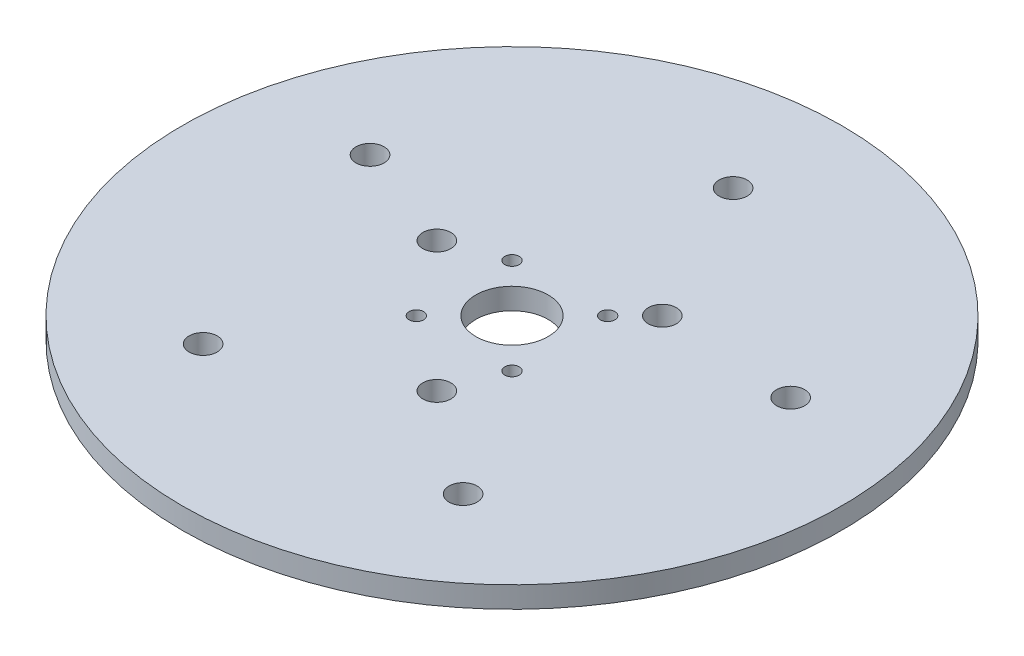
ISO-10303-21;
HEADER;
FILE_DESCRIPTION(('STEP AP214'),'2;1');
FILE_NAME('part.step','',(''),(''),'','','');
FILE_SCHEMA(('AUTOMOTIVE_DESIGN { 1 0 10303 214 1 1 1 1 }'));
ENDSEC;
DATA;
#1=APPLICATION_CONTEXT('core data for automotive mechanical design processes');
#2=APPLICATION_PROTOCOL_DEFINITION('international standard','automotive_design',2000,#1);
#3=PRODUCT_CONTEXT('',#1,'mechanical');
#4=PRODUCT('Part','Part','',(#3));
#5=PRODUCT_RELATED_PRODUCT_CATEGORY('part','',(#4));
#6=PRODUCT_DEFINITION_FORMATION('','',#4);
#7=PRODUCT_DEFINITION_CONTEXT('part definition',#1,'design');
#8=PRODUCT_DEFINITION('design','',#6,#7);
#9=PRODUCT_DEFINITION_SHAPE('','',#8);
#10=(LENGTH_UNIT() NAMED_UNIT(*) SI_UNIT(.MILLI.,.METRE.));
#11=(NAMED_UNIT(*) PLANE_ANGLE_UNIT() SI_UNIT($,.RADIAN.));
#12=(NAMED_UNIT(*) SI_UNIT($,.STERADIAN.) SOLID_ANGLE_UNIT());
#13=UNCERTAINTY_MEASURE_WITH_UNIT(LENGTH_MEASURE(1.E-05),#10,'distance_accuracy_value','');
#14=(GEOMETRIC_REPRESENTATION_CONTEXT(3) GLOBAL_UNCERTAINTY_ASSIGNED_CONTEXT((#13)) GLOBAL_UNIT_ASSIGNED_CONTEXT((#10,
#11,#12)) REPRESENTATION_CONTEXT('',''));
#15=CARTESIAN_POINT('',(0.,0.,0.));
#16=DIRECTION('',(0.,0.,1.));
#17=DIRECTION('',(1.,0.,0.));
#18=AXIS2_PLACEMENT_3D('',#15,#16,#17);
#19=CARTESIAN_POINT('',(0.,5.,0.));
#20=DIRECTION('',(0.,1.,0.));
#21=DIRECTION('',(0.,0.,1.));
#22=AXIS2_PLACEMENT_3D('',#19,#20,#21);
#23=PLANE('',#22);
#24=CARTESIAN_POINT('',(17.6776695296637,5.,-17.6776695296637));
#25=DIRECTION('',(0.,1.,0.));
#26=DIRECTION('',(0.,0.,1.));
#27=AXIS2_PLACEMENT_3D('',#24,#25,#26);
#28=CIRCLE('',#27,3.3);
#29=CARTESIAN_POINT('',(17.6776695296637,5.,-14.3776695296637));
#30=VERTEX_POINT('',#29);
#31=EDGE_CURVE('E118',#30,#30,#28,.T.);
#32=ORIENTED_EDGE('',*,*,#31,.F.);
#33=EDGE_LOOP('',(#32));
#34=FACE_BOUND('',#33,.T.);
#35=CARTESIAN_POINT('',(6.47047612756299,5.,24.1481456572267));
#36=DIRECTION('',(0.,1.,0.));
#37=DIRECTION('',(0.,0.,1.));
#38=AXIS2_PLACEMENT_3D('',#35,#36,#37);
#39=CIRCLE('',#38,3.3);
#40=CARTESIAN_POINT('',(6.47047612756299,5.,27.4481456572267));
#41=VERTEX_POINT('',#40);
#42=EDGE_CURVE('E112',#41,#41,#39,.T.);
#43=ORIENTED_EDGE('',*,*,#42,.F.);
#44=EDGE_LOOP('',(#43));
#45=FACE_BOUND('',#44,.T.);
#46=CARTESIAN_POINT('',(-24.1481456572267,5.,-6.47047612756307));
#47=DIRECTION('',(0.,1.,0.));
#48=DIRECTION('',(0.,0.,1.));
#49=AXIS2_PLACEMENT_3D('',#46,#47,#48);
#50=CIRCLE('',#49,3.3);
#51=CARTESIAN_POINT('',(-24.1481456572267,5.,-3.17047612756307));
#52=VERTEX_POINT('',#51);
#53=EDGE_CURVE('E106',#52,#52,#50,.T.);
#54=ORIENTED_EDGE('',*,*,#53,.F.);
#55=EDGE_LOOP('',(#54));
#56=FACE_BOUND('',#55,.T.);
#57=CARTESIAN_POINT('',(-11.25,5.,-11.25));
#58=DIRECTION('',(0.,1.,0.));
#59=DIRECTION('',(0.,0.,1.));
#60=AXIS2_PLACEMENT_3D('',#57,#58,#59);
#61=CIRCLE('',#60,1.7);
#62=CARTESIAN_POINT('',(-11.25,5.,-9.55));
#63=VERTEX_POINT('',#62);
#64=EDGE_CURVE('E100',#63,#63,#61,.T.);
#65=ORIENTED_EDGE('',*,*,#64,.F.);
#66=EDGE_LOOP('',(#65));
#67=FACE_BOUND('',#66,.T.);
#68=CARTESIAN_POINT('',(11.25,5.,11.25));
#69=DIRECTION('',(0.,1.,0.));
#70=DIRECTION('',(0.,0.,1.));
#71=AXIS2_PLACEMENT_3D('',#68,#69,#70);
#72=CIRCLE('',#71,1.7);
#73=CARTESIAN_POINT('',(11.25,5.,12.95));
#74=VERTEX_POINT('',#73);
#75=EDGE_CURVE('E94',#74,#74,#72,.T.);
#76=ORIENTED_EDGE('',*,*,#75,.F.);
#77=EDGE_LOOP('',(#76));
#78=FACE_BOUND('',#77,.T.);
#79=CARTESIAN_POINT('',(11.25,5.,-11.25));
#80=DIRECTION('',(0.,1.,0.));
#81=DIRECTION('',(0.,0.,1.));
#82=AXIS2_PLACEMENT_3D('',#79,#80,#81);
#83=CIRCLE('',#82,1.7);
#84=CARTESIAN_POINT('',(11.25,5.,-9.55));
#85=VERTEX_POINT('',#84);
#86=EDGE_CURVE('E88',#85,#85,#83,.T.);
#87=ORIENTED_EDGE('',*,*,#86,.F.);
#88=EDGE_LOOP('',(#87));
#89=FACE_BOUND('',#88,.T.);
#90=CARTESIAN_POINT('',(-11.25,5.,11.25));
#91=DIRECTION('',(0.,1.,0.));
#92=DIRECTION('',(0.,0.,1.));
#93=AXIS2_PLACEMENT_3D('',#90,#91,#92);
#94=CIRCLE('',#93,1.7);
#95=CARTESIAN_POINT('',(-11.25,5.,12.95));
#96=VERTEX_POINT('',#95);
#97=EDGE_CURVE('E82',#96,#96,#94,.T.);
#98=ORIENTED_EDGE('',*,*,#97,.F.);
#99=EDGE_LOOP('',(#98));
#100=FACE_BOUND('',#99,.T.);
#101=CARTESIAN_POINT('',(0.,5.,-52.));
#102=DIRECTION('',(0.,1.,0.));
#103=DIRECTION('',(0.,0.,1.));
#104=AXIS2_PLACEMENT_3D('',#101,#102,#103);
#105=CIRCLE('',#104,3.29999999999999);
#106=CARTESIAN_POINT('',(0.,5.,-48.7));
#107=VERTEX_POINT('',#106);
#108=EDGE_CURVE('E76',#107,#107,#105,.T.);
#109=ORIENTED_EDGE('',*,*,#108,.F.);
#110=EDGE_LOOP('',(#109));
#111=FACE_BOUND('',#110,.T.);
#112=CARTESIAN_POINT('',(49.454938847348,5.,-16.0688837074973));
#113=DIRECTION('',(0.,1.,0.));
#114=DIRECTION('',(0.,0.,1.));
#115=AXIS2_PLACEMENT_3D('',#112,#113,#114);
#116=CIRCLE('',#115,3.29999999999998);
#117=CARTESIAN_POINT('',(49.454938847348,5.,-12.7688837074973));
#118=VERTEX_POINT('',#117);
#119=EDGE_CURVE('E70',#118,#118,#116,.T.);
#120=ORIENTED_EDGE('',*,*,#119,.F.);
#121=EDGE_LOOP('',(#120));
#122=FACE_BOUND('',#121,.T.);
#123=CARTESIAN_POINT('',(30.5648331192086,5.,42.0688837074973));
#124=DIRECTION('',(0.,1.,0.));
#125=DIRECTION('',(0.,0.,1.));
#126=AXIS2_PLACEMENT_3D('',#123,#124,#125);
#127=CIRCLE('',#126,3.29999999999999);
#128=CARTESIAN_POINT('',(30.5648331192086,5.,45.3688837074972));
#129=VERTEX_POINT('',#128);
#130=EDGE_CURVE('E64',#129,#129,#127,.T.);
#131=ORIENTED_EDGE('',*,*,#130,.F.);
#132=EDGE_LOOP('',(#131));
#133=FACE_BOUND('',#132,.T.);
#134=CARTESIAN_POINT('',(-30.5648331192086,5.,42.0688837074973));
#135=DIRECTION('',(0.,1.,0.));
#136=DIRECTION('',(0.,0.,1.));
#137=AXIS2_PLACEMENT_3D('',#134,#135,#136);
#138=CIRCLE('',#137,3.29999999999999);
#139=CARTESIAN_POINT('',(-30.5648331192086,5.,45.3688837074973));
#140=VERTEX_POINT('',#139);
#141=EDGE_CURVE('E58',#140,#140,#138,.T.);
#142=ORIENTED_EDGE('',*,*,#141,.F.);
#143=EDGE_LOOP('',(#142));
#144=FACE_BOUND('',#143,.T.);
#145=CARTESIAN_POINT('',(-49.454938847348,5.,-16.0688837074973));
#146=DIRECTION('',(0.,1.,0.));
#147=DIRECTION('',(0.,0.,1.));
#148=AXIS2_PLACEMENT_3D('',#145,#146,#147);
#149=CIRCLE('',#148,3.29999999999999);
#150=CARTESIAN_POINT('',(-49.454938847348,5.,-12.7688837074973));
#151=VERTEX_POINT('',#150);
#152=EDGE_CURVE('E52',#151,#151,#149,.T.);
#153=ORIENTED_EDGE('',*,*,#152,.F.);
#154=EDGE_LOOP('',(#153));
#155=FACE_BOUND('',#154,.T.);
#156=CARTESIAN_POINT('',(0.,5.,0.));
#157=DIRECTION('',(0.,1.,0.));
#158=DIRECTION('',(0.,0.,1.));
#159=AXIS2_PLACEMENT_3D('',#156,#157,#158);
#160=CIRCLE('',#159,77.5);
#161=CARTESIAN_POINT('',(0.,5.,77.5));
#162=VERTEX_POINT('',#161);
#163=EDGE_CURVE('E10',#162,#162,#160,.T.);
#164=ORIENTED_EDGE('',*,*,#163,.T.);
#165=EDGE_LOOP('',(#164));
#166=FACE_BOUND('',#165,.T.);
#167=CARTESIAN_POINT('',(0.,5.,0.));
#168=DIRECTION('',(0.,1.,0.));
#169=DIRECTION('',(0.,0.,1.));
#170=AXIS2_PLACEMENT_3D('',#167,#168,#169);
#171=CIRCLE('',#170,8.5);
#172=CARTESIAN_POINT('',(0.,5.,8.5));
#173=VERTEX_POINT('',#172);
#174=EDGE_CURVE('E42',#173,#173,#171,.T.);
#175=ORIENTED_EDGE('',*,*,#174,.F.);
#176=EDGE_LOOP('',(#175));
#177=FACE_BOUND('',#176,.T.);
#178=ADVANCED_FACE('F31',(#34,#45,#56,#67,#78,#89,#100,#111,#122,#133,#144,#155,#166,#177),#23,.T.);
#179=CARTESIAN_POINT('',(0.,0.,0.));
#180=DIRECTION('',(0.,1.,0.));
#181=DIRECTION('',(0.,0.,1.));
#182=AXIS2_PLACEMENT_3D('',#179,#180,#181);
#183=PLANE('',#182);
#184=CARTESIAN_POINT('',(17.6776695296637,0.,-17.6776695296637));
#185=DIRECTION('',(0.,1.,0.));
#186=DIRECTION('',(0.,0.,1.));
#187=AXIS2_PLACEMENT_3D('',#184,#185,#186);
#188=CIRCLE('',#187,3.3);
#189=CARTESIAN_POINT('',(17.6776695296637,0.,-14.3776695296637));
#190=VERTEX_POINT('',#189);
#191=EDGE_CURVE('E115',#190,#190,#188,.T.);
#192=ORIENTED_EDGE('',*,*,#191,.T.);
#193=EDGE_LOOP('',(#192));
#194=FACE_BOUND('',#193,.T.);
#195=CARTESIAN_POINT('',(6.47047612756299,0.,24.1481456572267));
#196=DIRECTION('',(0.,1.,0.));
#197=DIRECTION('',(0.,0.,1.));
#198=AXIS2_PLACEMENT_3D('',#195,#196,#197);
#199=CIRCLE('',#198,3.3);
#200=CARTESIAN_POINT('',(6.47047612756299,0.,27.4481456572267));
#201=VERTEX_POINT('',#200);
#202=EDGE_CURVE('E109',#201,#201,#199,.T.);
#203=ORIENTED_EDGE('',*,*,#202,.T.);
#204=EDGE_LOOP('',(#203));
#205=FACE_BOUND('',#204,.T.);
#206=CARTESIAN_POINT('',(-24.1481456572267,0.,-6.47047612756307));
#207=DIRECTION('',(0.,1.,0.));
#208=DIRECTION('',(0.,0.,1.));
#209=AXIS2_PLACEMENT_3D('',#206,#207,#208);
#210=CIRCLE('',#209,3.3);
#211=CARTESIAN_POINT('',(-24.1481456572267,0.,-3.17047612756307));
#212=VERTEX_POINT('',#211);
#213=EDGE_CURVE('E103',#212,#212,#210,.T.);
#214=ORIENTED_EDGE('',*,*,#213,.T.);
#215=EDGE_LOOP('',(#214));
#216=FACE_BOUND('',#215,.T.);
#217=CARTESIAN_POINT('',(-11.25,0.,-11.25));
#218=DIRECTION('',(0.,1.,0.));
#219=DIRECTION('',(0.,0.,1.));
#220=AXIS2_PLACEMENT_3D('',#217,#218,#219);
#221=CIRCLE('',#220,1.7);
#222=CARTESIAN_POINT('',(-11.25,0.,-9.55));
#223=VERTEX_POINT('',#222);
#224=EDGE_CURVE('E97',#223,#223,#221,.T.);
#225=ORIENTED_EDGE('',*,*,#224,.T.);
#226=EDGE_LOOP('',(#225));
#227=FACE_BOUND('',#226,.T.);
#228=CARTESIAN_POINT('',(11.25,0.,11.25));
#229=DIRECTION('',(0.,1.,0.));
#230=DIRECTION('',(0.,0.,1.));
#231=AXIS2_PLACEMENT_3D('',#228,#229,#230);
#232=CIRCLE('',#231,1.7);
#233=CARTESIAN_POINT('',(11.25,0.,12.95));
#234=VERTEX_POINT('',#233);
#235=EDGE_CURVE('E91',#234,#234,#232,.T.);
#236=ORIENTED_EDGE('',*,*,#235,.T.);
#237=EDGE_LOOP('',(#236));
#238=FACE_BOUND('',#237,.T.);
#239=CARTESIAN_POINT('',(11.25,0.,-11.25));
#240=DIRECTION('',(0.,1.,0.));
#241=DIRECTION('',(0.,0.,1.));
#242=AXIS2_PLACEMENT_3D('',#239,#240,#241);
#243=CIRCLE('',#242,1.7);
#244=CARTESIAN_POINT('',(11.25,0.,-9.55));
#245=VERTEX_POINT('',#244);
#246=EDGE_CURVE('E85',#245,#245,#243,.T.);
#247=ORIENTED_EDGE('',*,*,#246,.T.);
#248=EDGE_LOOP('',(#247));
#249=FACE_BOUND('',#248,.T.);
#250=CARTESIAN_POINT('',(-11.25,0.,11.25));
#251=DIRECTION('',(0.,1.,0.));
#252=DIRECTION('',(0.,0.,1.));
#253=AXIS2_PLACEMENT_3D('',#250,#251,#252);
#254=CIRCLE('',#253,1.7);
#255=CARTESIAN_POINT('',(-11.25,0.,12.95));
#256=VERTEX_POINT('',#255);
#257=EDGE_CURVE('E79',#256,#256,#254,.T.);
#258=ORIENTED_EDGE('',*,*,#257,.T.);
#259=EDGE_LOOP('',(#258));
#260=FACE_BOUND('',#259,.T.);
#261=CARTESIAN_POINT('',(0.,0.,-52.));
#262=DIRECTION('',(0.,1.,0.));
#263=DIRECTION('',(0.,0.,1.));
#264=AXIS2_PLACEMENT_3D('',#261,#262,#263);
#265=CIRCLE('',#264,3.3);
#266=CARTESIAN_POINT('',(0.,0.,-48.7));
#267=VERTEX_POINT('',#266);
#268=EDGE_CURVE('E73',#267,#267,#265,.T.);
#269=ORIENTED_EDGE('',*,*,#268,.T.);
#270=EDGE_LOOP('',(#269));
#271=FACE_BOUND('',#270,.T.);
#272=CARTESIAN_POINT('',(49.454938847348,0.,-16.0688837074973));
#273=DIRECTION('',(0.,1.,0.));
#274=DIRECTION('',(0.,0.,1.));
#275=AXIS2_PLACEMENT_3D('',#272,#273,#274);
#276=CIRCLE('',#275,3.3);
#277=CARTESIAN_POINT('',(49.454938847348,0.,-12.7688837074973));
#278=VERTEX_POINT('',#277);
#279=EDGE_CURVE('E67',#278,#278,#276,.T.);
#280=ORIENTED_EDGE('',*,*,#279,.T.);
#281=EDGE_LOOP('',(#280));
#282=FACE_BOUND('',#281,.T.);
#283=CARTESIAN_POINT('',(30.5648331192086,0.,42.0688837074973));
#284=DIRECTION('',(0.,1.,0.));
#285=DIRECTION('',(0.,0.,1.));
#286=AXIS2_PLACEMENT_3D('',#283,#284,#285);
#287=CIRCLE('',#286,3.3);
#288=CARTESIAN_POINT('',(30.5648331192086,0.,45.3688837074973));
#289=VERTEX_POINT('',#288);
#290=EDGE_CURVE('E61',#289,#289,#287,.T.);
#291=ORIENTED_EDGE('',*,*,#290,.T.);
#292=EDGE_LOOP('',(#291));
#293=FACE_BOUND('',#292,.T.);
#294=CARTESIAN_POINT('',(-30.5648331192086,0.,42.0688837074973));
#295=DIRECTION('',(0.,1.,0.));
#296=DIRECTION('',(0.,0.,1.));
#297=AXIS2_PLACEMENT_3D('',#294,#295,#296);
#298=CIRCLE('',#297,3.3);
#299=CARTESIAN_POINT('',(-30.5648331192086,0.,45.3688837074973));
#300=VERTEX_POINT('',#299);
#301=EDGE_CURVE('E55',#300,#300,#298,.T.);
#302=ORIENTED_EDGE('',*,*,#301,.T.);
#303=EDGE_LOOP('',(#302));
#304=FACE_BOUND('',#303,.T.);
#305=CARTESIAN_POINT('',(-49.454938847348,0.,-16.0688837074973));
#306=DIRECTION('',(0.,1.,0.));
#307=DIRECTION('',(0.,0.,1.));
#308=AXIS2_PLACEMENT_3D('',#305,#306,#307);
#309=CIRCLE('',#308,3.3);
#310=CARTESIAN_POINT('',(-49.454938847348,0.,-12.7688837074973));
#311=VERTEX_POINT('',#310);
#312=EDGE_CURVE('E47',#311,#311,#309,.T.);
#313=ORIENTED_EDGE('',*,*,#312,.T.);
#314=EDGE_LOOP('',(#313));
#315=FACE_BOUND('',#314,.T.);
#316=CARTESIAN_POINT('',(0.,0.,0.));
#317=DIRECTION('',(0.,1.,0.));
#318=DIRECTION('',(0.,0.,1.));
#319=AXIS2_PLACEMENT_3D('',#316,#317,#318);
#320=CIRCLE('',#319,77.5);
#321=CARTESIAN_POINT('',(0.,0.,77.5));
#322=VERTEX_POINT('',#321);
#323=EDGE_CURVE('E35',#322,#322,#320,.T.);
#324=ORIENTED_EDGE('',*,*,#323,.F.);
#325=EDGE_LOOP('',(#324));
#326=FACE_BOUND('',#325,.T.);
#327=CARTESIAN_POINT('',(0.,0.,0.));
#328=DIRECTION('',(0.,1.,0.));
#329=DIRECTION('',(0.,0.,1.));
#330=AXIS2_PLACEMENT_3D('',#327,#328,#329);
#331=CIRCLE('',#330,8.5);
#332=CARTESIAN_POINT('',(0.,0.,8.5));
#333=VERTEX_POINT('',#332);
#334=EDGE_CURVE('E44',#333,#333,#331,.T.);
#335=ORIENTED_EDGE('',*,*,#334,.T.);
#336=EDGE_LOOP('',(#335));
#337=FACE_BOUND('',#336,.T.);
#338=ADVANCED_FACE('F126',(#194,#205,#216,#227,#238,#249,#260,#271,#282,#293,#304,#315,#326,
#337),#183,.F.);
#339=CARTESIAN_POINT('',(0.,5.,0.));
#340=DIRECTION('',(0.,-1.,0.));
#341=DIRECTION('',(0.,0.,-1.));
#342=AXIS2_PLACEMENT_3D('',#339,#340,#341);
#343=CYLINDRICAL_SURFACE('',#342,77.5);
#344=ORIENTED_EDGE('',*,*,#163,.F.);
#345=EDGE_LOOP('',(#344));
#346=FACE_BOUND('',#345,.T.);
#347=ORIENTED_EDGE('',*,*,#323,.T.);
#348=EDGE_LOOP('',(#347));
#349=FACE_BOUND('',#348,.T.);
#350=ADVANCED_FACE('F33',(#346,#349),#343,.T.);
#351=CARTESIAN_POINT('',(0.,5.,0.));
#352=DIRECTION('',(0.,-1.,0.));
#353=DIRECTION('',(0.,0.,-1.));
#354=AXIS2_PLACEMENT_3D('',#351,#352,#353);
#355=CYLINDRICAL_SURFACE('',#354,8.5);
#356=ORIENTED_EDGE('',*,*,#174,.T.);
#357=EDGE_LOOP('',(#356));
#358=FACE_BOUND('',#357,.T.);
#359=ORIENTED_EDGE('',*,*,#334,.F.);
#360=EDGE_LOOP('',(#359));
#361=FACE_BOUND('',#360,.T.);
#362=ADVANCED_FACE('F152',(#358,#361),#355,.F.);
#363=CARTESIAN_POINT('',(-49.454938847348,5.,-16.0688837074973));
#364=DIRECTION('',(0.,1.,0.));
#365=DIRECTION('',(0.,0.,1.));
#366=AXIS2_PLACEMENT_3D('',#363,#364,#365);
#367=CYLINDRICAL_SURFACE('',#366,3.29999999999999);
#368=ORIENTED_EDGE('',*,*,#312,.F.);
#369=EDGE_LOOP('',(#368));
#370=FACE_BOUND('',#369,.T.);
#371=ORIENTED_EDGE('',*,*,#152,.T.);
#372=EDGE_LOOP('',(#371));
#373=FACE_BOUND('',#372,.T.);
#374=ADVANCED_FACE('F155',(#370,#373),#367,.F.);
#375=CARTESIAN_POINT('',(-30.5648331192086,5.,42.0688837074973));
#376=DIRECTION('',(0.,1.,0.));
#377=DIRECTION('',(0.,0.,1.));
#378=AXIS2_PLACEMENT_3D('',#375,#376,#377);
#379=CYLINDRICAL_SURFACE('',#378,3.29999999999999);
#380=ORIENTED_EDGE('',*,*,#301,.F.);
#381=EDGE_LOOP('',(#380));
#382=FACE_BOUND('',#381,.T.);
#383=ORIENTED_EDGE('',*,*,#141,.T.);
#384=EDGE_LOOP('',(#383));
#385=FACE_BOUND('',#384,.T.);
#386=ADVANCED_FACE('F169',(#382,#385),#379,.F.);
#387=CARTESIAN_POINT('',(30.5648331192086,5.,42.0688837074973));
#388=DIRECTION('',(0.,1.,0.));
#389=DIRECTION('',(0.,0.,1.));
#390=AXIS2_PLACEMENT_3D('',#387,#388,#389);
#391=CYLINDRICAL_SURFACE('',#390,3.29999999999999);
#392=ORIENTED_EDGE('',*,*,#290,.F.);
#393=EDGE_LOOP('',(#392));
#394=FACE_BOUND('',#393,.T.);
#395=ORIENTED_EDGE('',*,*,#130,.T.);
#396=EDGE_LOOP('',(#395));
#397=FACE_BOUND('',#396,.T.);
#398=ADVANCED_FACE('F173',(#394,#397),#391,.F.);
#399=CARTESIAN_POINT('',(49.454938847348,5.,-16.0688837074973));
#400=DIRECTION('',(0.,1.,0.));
#401=DIRECTION('',(0.,0.,1.));
#402=AXIS2_PLACEMENT_3D('',#399,#400,#401);
#403=CYLINDRICAL_SURFACE('',#402,3.29999999999999);
#404=ORIENTED_EDGE('',*,*,#279,.F.);
#405=EDGE_LOOP('',(#404));
#406=FACE_BOUND('',#405,.T.);
#407=ORIENTED_EDGE('',*,*,#119,.T.);
#408=EDGE_LOOP('',(#407));
#409=FACE_BOUND('',#408,.T.);
#410=ADVANCED_FACE('F177',(#406,#409),#403,.F.);
#411=CARTESIAN_POINT('',(0.,5.,-52.));
#412=DIRECTION('',(0.,1.,0.));
#413=DIRECTION('',(0.,0.,1.));
#414=AXIS2_PLACEMENT_3D('',#411,#412,#413);
#415=CYLINDRICAL_SURFACE('',#414,3.29999999999999);
#416=ORIENTED_EDGE('',*,*,#268,.F.);
#417=EDGE_LOOP('',(#416));
#418=FACE_BOUND('',#417,.T.);
#419=ORIENTED_EDGE('',*,*,#108,.T.);
#420=EDGE_LOOP('',(#419));
#421=FACE_BOUND('',#420,.T.);
#422=ADVANCED_FACE('F181',(#418,#421),#415,.F.);
#423=CARTESIAN_POINT('',(-11.25,5.,11.25));
#424=DIRECTION('',(0.,1.,0.));
#425=DIRECTION('',(0.,0.,1.));
#426=AXIS2_PLACEMENT_3D('',#423,#424,#425);
#427=CYLINDRICAL_SURFACE('',#426,1.7);
#428=ORIENTED_EDGE('',*,*,#257,.F.);
#429=EDGE_LOOP('',(#428));
#430=FACE_BOUND('',#429,.T.);
#431=ORIENTED_EDGE('',*,*,#97,.T.);
#432=EDGE_LOOP('',(#431));
#433=FACE_BOUND('',#432,.T.);
#434=ADVANCED_FACE('F185',(#430,#433),#427,.F.);
#435=CARTESIAN_POINT('',(11.25,5.,-11.25));
#436=DIRECTION('',(0.,1.,0.));
#437=DIRECTION('',(0.,0.,1.));
#438=AXIS2_PLACEMENT_3D('',#435,#436,#437);
#439=CYLINDRICAL_SURFACE('',#438,1.7);
#440=ORIENTED_EDGE('',*,*,#246,.F.);
#441=EDGE_LOOP('',(#440));
#442=FACE_BOUND('',#441,.T.);
#443=ORIENTED_EDGE('',*,*,#86,.T.);
#444=EDGE_LOOP('',(#443));
#445=FACE_BOUND('',#444,.T.);
#446=ADVANCED_FACE('F189',(#442,#445),#439,.F.);
#447=CARTESIAN_POINT('',(11.25,5.,11.25));
#448=DIRECTION('',(0.,1.,0.));
#449=DIRECTION('',(0.,0.,1.));
#450=AXIS2_PLACEMENT_3D('',#447,#448,#449);
#451=CYLINDRICAL_SURFACE('',#450,1.7);
#452=ORIENTED_EDGE('',*,*,#235,.F.);
#453=EDGE_LOOP('',(#452));
#454=FACE_BOUND('',#453,.T.);
#455=ORIENTED_EDGE('',*,*,#75,.T.);
#456=EDGE_LOOP('',(#455));
#457=FACE_BOUND('',#456,.T.);
#458=ADVANCED_FACE('F193',(#454,#457),#451,.F.);
#459=CARTESIAN_POINT('',(-11.25,5.,-11.25));
#460=DIRECTION('',(0.,1.,0.));
#461=DIRECTION('',(0.,0.,1.));
#462=AXIS2_PLACEMENT_3D('',#459,#460,#461);
#463=CYLINDRICAL_SURFACE('',#462,1.7);
#464=ORIENTED_EDGE('',*,*,#224,.F.);
#465=EDGE_LOOP('',(#464));
#466=FACE_BOUND('',#465,.T.);
#467=ORIENTED_EDGE('',*,*,#64,.T.);
#468=EDGE_LOOP('',(#467));
#469=FACE_BOUND('',#468,.T.);
#470=ADVANCED_FACE('F197',(#466,#469),#463,.F.);
#471=CARTESIAN_POINT('',(-24.1481456572267,5.,-6.47047612756307));
#472=DIRECTION('',(0.,1.,0.));
#473=DIRECTION('',(0.,0.,1.));
#474=AXIS2_PLACEMENT_3D('',#471,#472,#473);
#475=CYLINDRICAL_SURFACE('',#474,3.3);
#476=ORIENTED_EDGE('',*,*,#213,.F.);
#477=EDGE_LOOP('',(#476));
#478=FACE_BOUND('',#477,.T.);
#479=ORIENTED_EDGE('',*,*,#53,.T.);
#480=EDGE_LOOP('',(#479));
#481=FACE_BOUND('',#480,.T.);
#482=ADVANCED_FACE('F201',(#478,#481),#475,.F.);
#483=CARTESIAN_POINT('',(6.47047612756299,5.,24.1481456572267));
#484=DIRECTION('',(0.,1.,0.));
#485=DIRECTION('',(0.,0.,1.));
#486=AXIS2_PLACEMENT_3D('',#483,#484,#485);
#487=CYLINDRICAL_SURFACE('',#486,3.3);
#488=ORIENTED_EDGE('',*,*,#202,.F.);
#489=EDGE_LOOP('',(#488));
#490=FACE_BOUND('',#489,.T.);
#491=ORIENTED_EDGE('',*,*,#42,.T.);
#492=EDGE_LOOP('',(#491));
#493=FACE_BOUND('',#492,.T.);
#494=ADVANCED_FACE('F205',(#490,#493),#487,.F.);
#495=CARTESIAN_POINT('',(17.6776695296637,5.,-17.6776695296637));
#496=DIRECTION('',(0.,1.,0.));
#497=DIRECTION('',(0.,0.,1.));
#498=AXIS2_PLACEMENT_3D('',#495,#496,#497);
#499=CYLINDRICAL_SURFACE('',#498,3.3);
#500=ORIENTED_EDGE('',*,*,#191,.F.);
#501=EDGE_LOOP('',(#500));
#502=FACE_BOUND('',#501,.T.);
#503=ORIENTED_EDGE('',*,*,#31,.T.);
#504=EDGE_LOOP('',(#503));
#505=FACE_BOUND('',#504,.T.);
#506=ADVANCED_FACE('F122',(#502,#505),#499,.F.);
#507=CLOSED_SHELL('',(#178,#338,#350,#362,#374,#386,#398,#410,#422,#434,#446,#458,#470,#482,
#494,#506));
#508=MANIFOLD_SOLID_BREP('B2',#507);
#509=ADVANCED_BREP_SHAPE_REPRESENTATION('',(#18,#508),#14);
#510=SHAPE_DEFINITION_REPRESENTATION(#9,#509);
ENDSEC;
END-ISO-10303-21;
